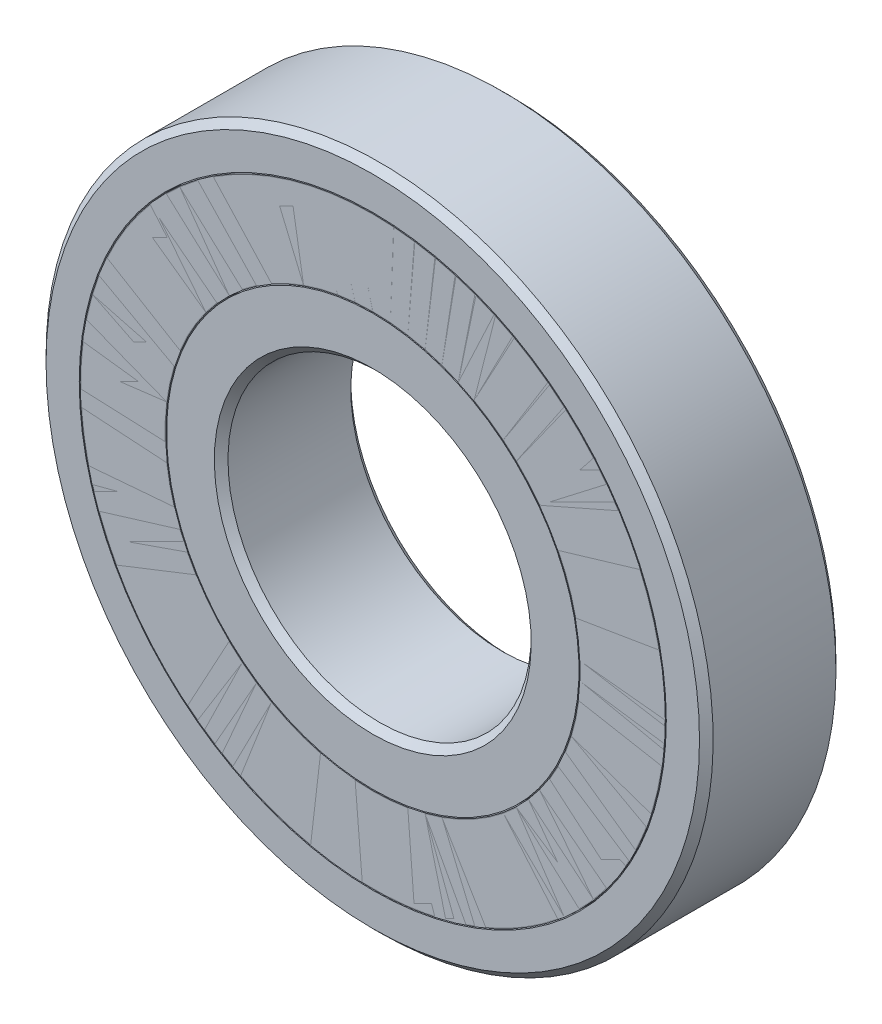
ISO-10303-21;
HEADER;
FILE_DESCRIPTION(('STEP AP214'),'2;1');
FILE_NAME('part.step','',(''),(''),'','','');
FILE_SCHEMA(('AUTOMOTIVE_DESIGN { 1 0 10303 214 1 1 1 1 }'));
ENDSEC;
DATA;
#1=APPLICATION_CONTEXT('core data for automotive mechanical design processes');
#2=APPLICATION_PROTOCOL_DEFINITION('international standard','automotive_design',2000,#1);
#3=PRODUCT_CONTEXT('',#1,'mechanical');
#4=PRODUCT('Part','Part','',(#3));
#5=PRODUCT_RELATED_PRODUCT_CATEGORY('part','',(#4));
#6=PRODUCT_DEFINITION_FORMATION('','',#4);
#7=PRODUCT_DEFINITION_CONTEXT('part definition',#1,'design');
#8=PRODUCT_DEFINITION('design','',#6,#7);
#9=PRODUCT_DEFINITION_SHAPE('','',#8);
#10=(LENGTH_UNIT() NAMED_UNIT(*) SI_UNIT(.MILLI.,.METRE.));
#11=(NAMED_UNIT(*) PLANE_ANGLE_UNIT() SI_UNIT($,.RADIAN.));
#12=(NAMED_UNIT(*) SI_UNIT($,.STERADIAN.) SOLID_ANGLE_UNIT());
#13=UNCERTAINTY_MEASURE_WITH_UNIT(LENGTH_MEASURE(1.E-05),#10,'distance_accuracy_value','');
#14=(GEOMETRIC_REPRESENTATION_CONTEXT(3) GLOBAL_UNCERTAINTY_ASSIGNED_CONTEXT((#13)) GLOBAL_UNIT_ASSIGNED_CONTEXT((#10,
#11,#12)) REPRESENTATION_CONTEXT('',''));
#15=CARTESIAN_POINT('',(0.,0.,0.));
#16=DIRECTION('',(0.,0.,1.));
#17=DIRECTION('',(1.,0.,0.));
#18=AXIS2_PLACEMENT_3D('',#15,#16,#17);
#19=CARTESIAN_POINT('',(0.,0.,-46.8926305280376));
#20=DIRECTION('',(0.,0.,1.));
#21=DIRECTION('',(0.,1.,0.));
#22=AXIS2_PLACEMENT_3D('',#19,#20,#21);
#23=CYLINDRICAL_SURFACE('',#22,15.3162);
#24=CARTESIAN_POINT('',(0.,0.,-3.540125));
#25=DIRECTION('',(0.,0.,-1.));
#26=DIRECTION('',(0.,1.,0.));
#27=AXIS2_PLACEMENT_3D('',#24,#25,#26);
#28=CIRCLE('',#27,15.3162);
#29=CARTESIAN_POINT('',(0.,15.3162,-3.540125));
#30=VERTEX_POINT('',#29);
#31=EDGE_CURVE('E11',#30,#30,#28,.T.);
#32=ORIENTED_EDGE('',*,*,#31,.F.);
#33=EDGE_LOOP('',(#32));
#34=FACE_BOUND('',#33,.T.);
#35=CARTESIAN_POINT('',(0.,0.,3.571875));
#36=DIRECTION('',(0.,0.,-1.));
#37=DIRECTION('',(0.,1.,0.));
#38=AXIS2_PLACEMENT_3D('',#35,#36,#37);
#39=CIRCLE('',#38,15.3162);
#40=CARTESIAN_POINT('',(0.,15.3162,3.571875));
#41=VERTEX_POINT('',#40);
#42=EDGE_CURVE('E63',#41,#41,#39,.T.);
#43=ORIENTED_EDGE('',*,*,#42,.T.);
#44=EDGE_LOOP('',(#43));
#45=FACE_BOUND('',#44,.T.);
#46=ADVANCED_FACE('F43',(#34,#45),#23,.T.);
#47=CARTESIAN_POINT('',(0.,0.,3.571875));
#48=DIRECTION('',(0.,0.,1.));
#49=DIRECTION('',(0.,1.,0.));
#50=AXIS2_PLACEMENT_3D('',#47,#48,#49);
#51=PLANE('',#50);
#52=CARTESIAN_POINT('',(0.,0.,3.571875));
#53=DIRECTION('',(0.,0.,-1.));
#54=DIRECTION('',(0.,1.,0.));
#55=AXIS2_PLACEMENT_3D('',#52,#53,#54);
#56=CIRCLE('',#55,10.8458);
#57=CARTESIAN_POINT('',(0.,10.8458,3.571875));
#58=VERTEX_POINT('',#57);
#59=EDGE_CURVE('E66',#58,#58,#56,.T.);
#60=ORIENTED_EDGE('',*,*,#59,.T.);
#61=EDGE_LOOP('',(#60));
#62=FACE_BOUND('',#61,.T.);
#63=ORIENTED_EDGE('',*,*,#42,.F.);
#64=EDGE_LOOP('',(#63));
#65=FACE_BOUND('',#64,.T.);
#66=ADVANCED_FACE('F70',(#62,#65),#51,.T.);
#67=CARTESIAN_POINT('',(0.,0.,-46.8926305280376));
#68=DIRECTION('',(0.,0.,1.));
#69=DIRECTION('',(0.,1.,0.));
#70=AXIS2_PLACEMENT_3D('',#67,#68,#69);
#71=CYLINDRICAL_SURFACE('',#70,10.8458);
#72=CARTESIAN_POINT('',(0.,0.,-3.540125));
#73=DIRECTION('',(0.,0.,-1.));
#74=DIRECTION('',(0.,1.,0.));
#75=AXIS2_PLACEMENT_3D('',#72,#73,#74);
#76=CIRCLE('',#75,10.8458);
#77=CARTESIAN_POINT('',(0.,10.8458,-3.540125));
#78=VERTEX_POINT('',#77);
#79=EDGE_CURVE('E58',#78,#78,#76,.F.);
#80=ORIENTED_EDGE('',*,*,#79,.F.);
#81=EDGE_LOOP('',(#80));
#82=FACE_BOUND('',#81,.T.);
#83=ORIENTED_EDGE('',*,*,#59,.F.);
#84=EDGE_LOOP('',(#83));
#85=FACE_BOUND('',#84,.T.);
#86=ADVANCED_FACE('F73',(#82,#85),#71,.F.);
#87=CARTESIAN_POINT('',(0.,17.1053125,-3.571875));
#88=DIRECTION('',(0.,0.,1.));
#89=DIRECTION('',(0.,1.,0.));
#90=AXIS2_PLACEMENT_3D('',#87,#88,#89);
#91=PLANE('',#90);
#92=CARTESIAN_POINT('',(0.,0.,-3.57187499999999));
#93=DIRECTION('',(0.,0.,-1.));
#94=DIRECTION('',(0.,1.,0.));
#95=AXIS2_PLACEMENT_3D('',#92,#93,#94);
#96=CIRCLE('',#95,10.87755);
#97=CARTESIAN_POINT('',(0.,10.87755,-3.571875));
#98=VERTEX_POINT('',#97);
#99=EDGE_CURVE('E50',#98,#98,#96,.T.);
#100=ORIENTED_EDGE('',*,*,#99,.F.);
#101=EDGE_LOOP('',(#100));
#102=FACE_BOUND('',#101,.T.);
#103=CARTESIAN_POINT('',(0.,0.,-3.57187499999999));
#104=DIRECTION('',(0.,0.,-1.));
#105=DIRECTION('',(0.,1.,0.));
#106=AXIS2_PLACEMENT_3D('',#103,#104,#105);
#107=CIRCLE('',#106,15.28445);
#108=CARTESIAN_POINT('',(0.,15.28445,-3.571875));
#109=VERTEX_POINT('',#108);
#110=EDGE_CURVE('E54',#109,#109,#107,.F.);
#111=ORIENTED_EDGE('',*,*,#110,.F.);
#112=EDGE_LOOP('',(#111));
#113=FACE_BOUND('',#112,.T.);
#114=ADVANCED_FACE('F75',(#102,#113),#91,.F.);
#115=CARTESIAN_POINT('',(0.,0.,-3.540125));
#116=DIRECTION('',(0.,0.,1.));
#117=DIRECTION('',(0.,1.,0.));
#118=AXIS2_PLACEMENT_3D('',#115,#116,#117);
#119=TOROIDAL_SURFACE('',#118,10.87755,0.03175);
#120=ORIENTED_EDGE('',*,*,#99,.T.);
#121=EDGE_LOOP('',(#120));
#122=FACE_BOUND('',#121,.T.);
#123=ORIENTED_EDGE('',*,*,#79,.T.);
#124=EDGE_LOOP('',(#123));
#125=FACE_BOUND('',#124,.T.);
#126=ADVANCED_FACE('F82',(#122,#125),#119,.T.);
#127=CARTESIAN_POINT('',(0.,0.,-3.540125));
#128=DIRECTION('',(0.,0.,1.));
#129=DIRECTION('',(0.,1.,0.));
#130=AXIS2_PLACEMENT_3D('',#127,#128,#129);
#131=TOROIDAL_SURFACE('',#130,15.28445,0.03175);
#132=ORIENTED_EDGE('',*,*,#31,.T.);
#133=EDGE_LOOP('',(#132));
#134=FACE_BOUND('',#133,.T.);
#135=ORIENTED_EDGE('',*,*,#110,.T.);
#136=EDGE_LOOP('',(#135));
#137=FACE_BOUND('',#136,.T.);
#138=ADVANCED_FACE('F45',(#134,#137),#131,.T.);
#139=CLOSED_SHELL('',(#46,#66,#86,#114,#126,#138));
#140=MANIFOLD_SOLID_BREP('B2',#139);
#141=CARTESIAN_POINT('',(0.,0.,46.8926305280376));
#142=DIRECTION('',(0.,0.,-1.));
#143=DIRECTION('',(0.,1.,0.));
#144=AXIS2_PLACEMENT_3D('',#141,#142,#143);
#145=CYLINDRICAL_SURFACE('',#144,15.3162);
#146=CARTESIAN_POINT('',(0.,0.,3.540125));
#147=DIRECTION('',(0.,0.,-1.));
#148=DIRECTION('',(0.,1.,0.));
#149=AXIS2_PLACEMENT_3D('',#146,#147,#148);
#150=CIRCLE('',#149,15.3162);
#151=CARTESIAN_POINT('',(0.,15.3162,3.540125));
#152=VERTEX_POINT('',#151);
#153=EDGE_CURVE('E42',#152,#152,#150,.T.);
#154=ORIENTED_EDGE('',*,*,#153,.T.);
#155=EDGE_LOOP('',(#154));
#156=FACE_BOUND('',#155,.T.);
#157=CARTESIAN_POINT('',(0.,0.,-3.571875));
#158=DIRECTION('',(0.,0.,-1.));
#159=DIRECTION('',(0.,1.,0.));
#160=AXIS2_PLACEMENT_3D('',#157,#158,#159);
#161=CIRCLE('',#160,15.3162);
#162=CARTESIAN_POINT('',(0.,15.3162,-3.571875));
#163=VERTEX_POINT('',#162);
#164=EDGE_CURVE('E187',#163,#163,#161,.T.);
#165=ORIENTED_EDGE('',*,*,#164,.F.);
#166=EDGE_LOOP('',(#165));
#167=FACE_BOUND('',#166,.T.);
#168=ADVANCED_FACE('F167',(#156,#167),#145,.T.);
#169=CARTESIAN_POINT('',(0.,0.,-3.571875));
#170=DIRECTION('',(0.,0.,-1.));
#171=DIRECTION('',(0.,1.,0.));
#172=AXIS2_PLACEMENT_3D('',#169,#170,#171);
#173=PLANE('',#172);
#174=CARTESIAN_POINT('',(0.,0.,-3.571875));
#175=DIRECTION('',(0.,0.,-1.));
#176=DIRECTION('',(0.,1.,0.));
#177=AXIS2_PLACEMENT_3D('',#174,#175,#176);
#178=CIRCLE('',#177,10.8458);
#179=CARTESIAN_POINT('',(0.,10.8458,-3.571875));
#180=VERTEX_POINT('',#179);
#181=EDGE_CURVE('E190',#180,#180,#178,.T.);
#182=ORIENTED_EDGE('',*,*,#181,.F.);
#183=EDGE_LOOP('',(#182));
#184=FACE_BOUND('',#183,.T.);
#185=ORIENTED_EDGE('',*,*,#164,.T.);
#186=EDGE_LOOP('',(#185));
#187=FACE_BOUND('',#186,.T.);
#188=ADVANCED_FACE('F196',(#184,#187),#173,.T.);
#189=CARTESIAN_POINT('',(0.,0.,46.8926305280376));
#190=DIRECTION('',(0.,0.,-1.));
#191=DIRECTION('',(0.,1.,0.));
#192=AXIS2_PLACEMENT_3D('',#189,#190,#191);
#193=CYLINDRICAL_SURFACE('',#192,10.8458);
#194=CARTESIAN_POINT('',(0.,0.,3.540125));
#195=DIRECTION('',(0.,0.,-1.));
#196=DIRECTION('',(0.,1.,0.));
#197=AXIS2_PLACEMENT_3D('',#194,#195,#196);
#198=CIRCLE('',#197,10.8458);
#199=CARTESIAN_POINT('',(0.,10.8458,3.540125));
#200=VERTEX_POINT('',#199);
#201=EDGE_CURVE('E182',#200,#200,#198,.F.);
#202=ORIENTED_EDGE('',*,*,#201,.T.);
#203=EDGE_LOOP('',(#202));
#204=FACE_BOUND('',#203,.T.);
#205=ORIENTED_EDGE('',*,*,#181,.T.);
#206=EDGE_LOOP('',(#205));
#207=FACE_BOUND('',#206,.T.);
#208=ADVANCED_FACE('F194',(#204,#207),#193,.F.);
#209=CARTESIAN_POINT('',(0.,17.1053125,3.571875));
#210=DIRECTION('',(0.,0.,-1.));
#211=DIRECTION('',(0.,1.,0.));
#212=AXIS2_PLACEMENT_3D('',#209,#210,#211);
#213=PLANE('',#212);
#214=CARTESIAN_POINT('',(0.,0.,3.57187499999999));
#215=DIRECTION('',(0.,0.,-1.));
#216=DIRECTION('',(0.,1.,0.));
#217=AXIS2_PLACEMENT_3D('',#214,#215,#216);
#218=CIRCLE('',#217,10.87755);
#219=CARTESIAN_POINT('',(0.,10.87755,3.571875));
#220=VERTEX_POINT('',#219);
#221=EDGE_CURVE('E174',#220,#220,#218,.T.);
#222=ORIENTED_EDGE('',*,*,#221,.T.);
#223=EDGE_LOOP('',(#222));
#224=FACE_BOUND('',#223,.T.);
#225=CARTESIAN_POINT('',(0.,0.,3.57187499999999));
#226=DIRECTION('',(0.,0.,-1.));
#227=DIRECTION('',(0.,1.,0.));
#228=AXIS2_PLACEMENT_3D('',#225,#226,#227);
#229=CIRCLE('',#228,15.28445);
#230=CARTESIAN_POINT('',(0.,15.28445,3.571875));
#231=VERTEX_POINT('',#230);
#232=EDGE_CURVE('E178',#231,#231,#229,.F.);
#233=ORIENTED_EDGE('',*,*,#232,.T.);
#234=EDGE_LOOP('',(#233));
#235=FACE_BOUND('',#234,.T.);
#236=ADVANCED_FACE('F209',(#224,#235),#213,.F.);
#237=CARTESIAN_POINT('',(0.,0.,3.540125));
#238=DIRECTION('',(0.,0.,-1.));
#239=DIRECTION('',(0.,1.,0.));
#240=AXIS2_PLACEMENT_3D('',#237,#238,#239);
#241=TOROIDAL_SURFACE('',#240,10.87755,0.03175);
#242=ORIENTED_EDGE('',*,*,#221,.F.);
#243=EDGE_LOOP('',(#242));
#244=FACE_BOUND('',#243,.T.);
#245=ORIENTED_EDGE('',*,*,#201,.F.);
#246=EDGE_LOOP('',(#245));
#247=FACE_BOUND('',#246,.T.);
#248=ADVANCED_FACE('F207',(#244,#247),#241,.T.);
#249=CARTESIAN_POINT('',(0.,0.,3.540125));
#250=DIRECTION('',(0.,0.,-1.));
#251=DIRECTION('',(0.,1.,0.));
#252=AXIS2_PLACEMENT_3D('',#249,#250,#251);
#253=TOROIDAL_SURFACE('',#252,15.28445,0.03175);
#254=ORIENTED_EDGE('',*,*,#153,.F.);
#255=EDGE_LOOP('',(#254));
#256=FACE_BOUND('',#255,.T.);
#257=ORIENTED_EDGE('',*,*,#232,.F.);
#258=EDGE_LOOP('',(#257));
#259=FACE_BOUND('',#258,.T.);
#260=ADVANCED_FACE('F169',(#256,#259),#253,.T.);
#261=CLOSED_SHELL('',(#168,#188,#208,#236,#248,#260));
#262=MANIFOLD_SOLID_BREP('B6',#261);
#263=CARTESIAN_POINT('',(0.,0.,3.571875));
#264=DIRECTION('',(0.,0.,1.));
#265=DIRECTION('',(0.,-1.,0.));
#266=AXIS2_PLACEMENT_3D('',#263,#264,#265);
#267=CYLINDRICAL_SURFACE('',#266,10.795);
#268=CARTESIAN_POINT('',(0.,0.,3.571875));
#269=DIRECTION('',(0.,0.,1.));
#270=DIRECTION('',(0.,-1.,0.));
#271=AXIS2_PLACEMENT_3D('',#268,#269,#270);
#272=CIRCLE('',#271,10.795);
#273=CARTESIAN_POINT('',(0.,-10.795,3.57187499999999));
#274=VERTEX_POINT('',#273);
#275=EDGE_CURVE('E166',#274,#274,#272,.T.);
#276=ORIENTED_EDGE('',*,*,#275,.F.);
#277=EDGE_LOOP('',(#276));
#278=FACE_BOUND('',#277,.T.);
#279=CARTESIAN_POINT('',(0.,0.,1.5875));
#280=DIRECTION('',(0.,0.,1.));
#281=DIRECTION('',(0.,-1.,0.));
#282=AXIS2_PLACEMENT_3D('',#279,#280,#281);
#283=CIRCLE('',#282,10.795);
#284=CARTESIAN_POINT('',(0.,-10.795,1.5875));
#285=VERTEX_POINT('',#284);
#286=EDGE_CURVE('E293',#285,#285,#283,.T.);
#287=ORIENTED_EDGE('',*,*,#286,.T.);
#288=EDGE_LOOP('',(#287));
#289=FACE_BOUND('',#288,.T.);
#290=ADVANCED_FACE('F265',(#278,#289),#267,.T.);
#291=CARTESIAN_POINT('',(0.,8.29468749999999,3.571875));
#292=DIRECTION('',(0.,0.,-1.));
#293=DIRECTION('',(0.,1.,0.));
#294=AXIS2_PLACEMENT_3D('',#291,#292,#293);
#295=PLANE('',#294);
#296=CARTESIAN_POINT('',(0.,0.,3.571875));
#297=DIRECTION('',(0.,0.,1.));
#298=DIRECTION('',(0.,-1.,0.));
#299=AXIS2_PLACEMENT_3D('',#296,#297,#298);
#300=CIRCLE('',#299,8.29468749999999);
#301=CARTESIAN_POINT('',(0.,-8.29468749999999,3.57187499999999));
#302=VERTEX_POINT('',#301);
#303=EDGE_CURVE('E271',#302,#302,#300,.T.);
#304=ORIENTED_EDGE('',*,*,#303,.F.);
#305=EDGE_LOOP('',(#304));
#306=FACE_BOUND('',#305,.T.);
#307=ORIENTED_EDGE('',*,*,#275,.T.);
#308=EDGE_LOOP('',(#307));
#309=FACE_BOUND('',#308,.T.);
#310=ADVANCED_FACE('F330',(#306,#309),#295,.F.);
#311=CARTESIAN_POINT('',(0.,0.,3.571875));
#312=DIRECTION('',(0.,0.,1.));
#313=DIRECTION('',(0.,-1.,0.));
#314=AXIS2_PLACEMENT_3D('',#311,#312,#313);
#315=CONICAL_SURFACE('',#314,8.29468749999999,0.785398163397436);
#316=CARTESIAN_POINT('',(0.,0.,3.2146875));
#317=DIRECTION('',(0.,0.,1.));
#318=DIRECTION('',(0.,-1.,0.));
#319=AXIS2_PLACEMENT_3D('',#316,#317,#318);
#320=CIRCLE('',#319,7.9375);
#321=CARTESIAN_POINT('',(0.,-7.9375,3.21468749999999));
#322=VERTEX_POINT('',#321);
#323=EDGE_CURVE('E275',#322,#322,#320,.T.);
#324=ORIENTED_EDGE('',*,*,#323,.F.);
#325=EDGE_LOOP('',(#324));
#326=FACE_BOUND('',#325,.T.);
#327=ORIENTED_EDGE('',*,*,#303,.T.);
#328=EDGE_LOOP('',(#327));
#329=FACE_BOUND('',#328,.T.);
#330=ADVANCED_FACE('F325',(#326,#329),#315,.F.);
#331=CARTESIAN_POINT('',(0.,0.,3.571875));
#332=DIRECTION('',(0.,0.,1.));
#333=DIRECTION('',(0.,-1.,0.));
#334=AXIS2_PLACEMENT_3D('',#331,#332,#333);
#335=CYLINDRICAL_SURFACE('',#334,7.9375);
#336=CARTESIAN_POINT('',(0.,0.,-3.2146875));
#337=DIRECTION('',(0.,0.,1.));
#338=DIRECTION('',(0.,-1.,0.));
#339=AXIS2_PLACEMENT_3D('',#336,#337,#338);
#340=CIRCLE('',#339,7.9375);
#341=CARTESIAN_POINT('',(0.,-7.9375,-3.2146875));
#342=VERTEX_POINT('',#341);
#343=EDGE_CURVE('E279',#342,#342,#340,.T.);
#344=ORIENTED_EDGE('',*,*,#343,.F.);
#345=EDGE_LOOP('',(#344));
#346=FACE_BOUND('',#345,.T.);
#347=ORIENTED_EDGE('',*,*,#323,.T.);
#348=EDGE_LOOP('',(#347));
#349=FACE_BOUND('',#348,.T.);
#350=ADVANCED_FACE('F319',(#346,#349),#335,.F.);
#351=CARTESIAN_POINT('',(0.,0.,-3.2146875));
#352=DIRECTION('',(0.,0.,-1.));
#353=DIRECTION('',(0.,1.,0.));
#354=AXIS2_PLACEMENT_3D('',#351,#352,#353);
#355=CONICAL_SURFACE('',#354,7.9375,0.785398163397419);
#356=CARTESIAN_POINT('',(0.,0.,-3.57187500000001));
#357=DIRECTION('',(0.,0.,1.));
#358=DIRECTION('',(0.,-1.,0.));
#359=AXIS2_PLACEMENT_3D('',#356,#357,#358);
#360=CIRCLE('',#359,8.29468749999999);
#361=CARTESIAN_POINT('',(0.,-8.29468749999999,-3.57187500000001));
#362=VERTEX_POINT('',#361);
#363=EDGE_CURVE('E284',#362,#362,#360,.T.);
#364=ORIENTED_EDGE('',*,*,#363,.F.);
#365=EDGE_LOOP('',(#364));
#366=FACE_BOUND('',#365,.T.);
#367=ORIENTED_EDGE('',*,*,#343,.T.);
#368=EDGE_LOOP('',(#367));
#369=FACE_BOUND('',#368,.T.);
#370=ADVANCED_FACE('F313',(#366,#369),#355,.F.);
#371=CARTESIAN_POINT('',(0.,8.29468749999999,-3.571875));
#372=DIRECTION('',(0.,0.,1.));
#373=DIRECTION('',(0.,-1.,0.));
#374=AXIS2_PLACEMENT_3D('',#371,#372,#373);
#375=PLANE('',#374);
#376=CARTESIAN_POINT('',(0.,0.,-3.571875));
#377=DIRECTION('',(0.,0.,1.));
#378=DIRECTION('',(0.,-1.,0.));
#379=AXIS2_PLACEMENT_3D('',#376,#377,#378);
#380=CIRCLE('',#379,10.795);
#381=CARTESIAN_POINT('',(0.,-10.795,-3.571875));
#382=VERTEX_POINT('',#381);
#383=EDGE_CURVE('E287',#382,#382,#380,.T.);
#384=ORIENTED_EDGE('',*,*,#383,.F.);
#385=EDGE_LOOP('',(#384));
#386=FACE_BOUND('',#385,.T.);
#387=ORIENTED_EDGE('',*,*,#363,.T.);
#388=EDGE_LOOP('',(#387));
#389=FACE_BOUND('',#388,.T.);
#390=ADVANCED_FACE('F307',(#386,#389),#375,.F.);
#391=CARTESIAN_POINT('',(0.,0.,3.571875));
#392=DIRECTION('',(0.,0.,1.));
#393=DIRECTION('',(0.,-1.,0.));
#394=AXIS2_PLACEMENT_3D('',#391,#392,#393);
#395=CYLINDRICAL_SURFACE('',#394,10.795);
#396=CARTESIAN_POINT('',(0.,0.,-1.5875));
#397=DIRECTION('',(0.,0.,1.));
#398=DIRECTION('',(0.,-1.,0.));
#399=AXIS2_PLACEMENT_3D('',#396,#397,#398);
#400=CIRCLE('',#399,10.795);
#401=CARTESIAN_POINT('',(0.,-10.795,-1.58750000000001));
#402=VERTEX_POINT('',#401);
#403=EDGE_CURVE('E290',#402,#402,#400,.T.);
#404=ORIENTED_EDGE('',*,*,#403,.F.);
#405=EDGE_LOOP('',(#404));
#406=FACE_BOUND('',#405,.T.);
#407=ORIENTED_EDGE('',*,*,#383,.T.);
#408=EDGE_LOOP('',(#407));
#409=FACE_BOUND('',#408,.T.);
#410=ADVANCED_FACE('F301',(#406,#409),#395,.T.);
#411=CARTESIAN_POINT('',(0.,0.,0.));
#412=DIRECTION('',(0.,0.,1.));
#413=DIRECTION('',(0.,-1.,0.));
#414=AXIS2_PLACEMENT_3D('',#411,#412,#413);
#415=TOROIDAL_SURFACE('',#414,13.462,3.10371475010188);
#416=ORIENTED_EDGE('',*,*,#286,.F.);
#417=EDGE_LOOP('',(#416));
#418=FACE_BOUND('',#417,.T.);
#419=ORIENTED_EDGE('',*,*,#403,.T.);
#420=EDGE_LOOP('',(#419));
#421=FACE_BOUND('',#420,.T.);
#422=ADVANCED_FACE('F298',(#418,#421),#415,.F.);
#423=CLOSED_SHELL('',(#290,#310,#330,#350,#370,#390,#410,#422));
#424=MANIFOLD_SOLID_BREP('B37',#423);
#425=CARTESIAN_POINT('',(0.,0.,3.571875));
#426=DIRECTION('',(0.,0.,1.));
#427=DIRECTION('',(0.,-1.,0.));
#428=AXIS2_PLACEMENT_3D('',#425,#426,#427);
#429=CYLINDRICAL_SURFACE('',#428,17.4625);
#430=CARTESIAN_POINT('',(0.,0.,3.21468749999999));
#431=DIRECTION('',(0.,0.,1.));
#432=DIRECTION('',(0.,-1.,0.));
#433=AXIS2_PLACEMENT_3D('',#430,#431,#432);
#434=CIRCLE('',#433,17.4625);
#435=CARTESIAN_POINT('',(0.,-17.4625,3.21468749999999));
#436=VERTEX_POINT('',#435);
#437=EDGE_CURVE('E264',#436,#436,#434,.T.);
#438=ORIENTED_EDGE('',*,*,#437,.F.);
#439=EDGE_LOOP('',(#438));
#440=FACE_BOUND('',#439,.T.);
#441=CARTESIAN_POINT('',(0.,0.,-3.2146875));
#442=DIRECTION('',(0.,0.,1.));
#443=DIRECTION('',(0.,-1.,0.));
#444=AXIS2_PLACEMENT_3D('',#441,#442,#443);
#445=CIRCLE('',#444,17.4625);
#446=CARTESIAN_POINT('',(0.,-17.4625,-3.21468750000001));
#447=VERTEX_POINT('',#446);
#448=EDGE_CURVE('E414',#447,#447,#445,.T.);
#449=ORIENTED_EDGE('',*,*,#448,.T.);
#450=EDGE_LOOP('',(#449));
#451=FACE_BOUND('',#450,.T.);
#452=ADVANCED_FACE('F386',(#440,#451),#429,.T.);
#453=CARTESIAN_POINT('',(0.,0.,3.21468749999999));
#454=DIRECTION('',(0.,0.,-1.));
#455=DIRECTION('',(0.,1.,0.));
#456=AXIS2_PLACEMENT_3D('',#453,#454,#455);
#457=CONICAL_SURFACE('',#456,17.4625,0.785398163397446);
#458=CARTESIAN_POINT('',(0.,0.,3.57187499999999));
#459=DIRECTION('',(0.,0.,1.));
#460=DIRECTION('',(0.,-1.,0.));
#461=AXIS2_PLACEMENT_3D('',#458,#459,#460);
#462=CIRCLE('',#461,17.1053125);
#463=CARTESIAN_POINT('',(0.,-17.1053125,3.57187499999999));
#464=VERTEX_POINT('',#463);
#465=EDGE_CURVE('E392',#464,#464,#462,.T.);
#466=ORIENTED_EDGE('',*,*,#465,.F.);
#467=EDGE_LOOP('',(#466));
#468=FACE_BOUND('',#467,.T.);
#469=ORIENTED_EDGE('',*,*,#437,.T.);
#470=EDGE_LOOP('',(#469));
#471=FACE_BOUND('',#470,.T.);
#472=ADVANCED_FACE('F451',(#468,#471),#457,.T.);
#473=CARTESIAN_POINT('',(0.,17.1053125,3.571875));
#474=DIRECTION('',(0.,0.,-1.));
#475=DIRECTION('',(0.,1.,0.));
#476=AXIS2_PLACEMENT_3D('',#473,#474,#475);
#477=PLANE('',#476);
#478=CARTESIAN_POINT('',(0.,0.,3.57187499999999));
#479=DIRECTION('',(0.,0.,1.));
#480=DIRECTION('',(0.,-1.,0.));
#481=AXIS2_PLACEMENT_3D('',#478,#479,#480);
#482=CIRCLE('',#481,15.367);
#483=CARTESIAN_POINT('',(0.,-15.367,3.57187499999999));
#484=VERTEX_POINT('',#483);
#485=EDGE_CURVE('E396',#484,#484,#482,.T.);
#486=ORIENTED_EDGE('',*,*,#485,.F.);
#487=EDGE_LOOP('',(#486));
#488=FACE_BOUND('',#487,.T.);
#489=ORIENTED_EDGE('',*,*,#465,.T.);
#490=EDGE_LOOP('',(#489));
#491=FACE_BOUND('',#490,.T.);
#492=ADVANCED_FACE('F446',(#488,#491),#477,.F.);
#493=CARTESIAN_POINT('',(0.,0.,3.571875));
#494=DIRECTION('',(0.,0.,1.));
#495=DIRECTION('',(0.,-1.,0.));
#496=AXIS2_PLACEMENT_3D('',#493,#494,#495);
#497=CYLINDRICAL_SURFACE('',#496,15.367);
#498=CARTESIAN_POINT('',(0.,0.,1.5875));
#499=DIRECTION('',(0.,0.,1.));
#500=DIRECTION('',(0.,-1.,0.));
#501=AXIS2_PLACEMENT_3D('',#498,#499,#500);
#502=CIRCLE('',#501,15.367);
#503=CARTESIAN_POINT('',(0.,-15.367,1.58749999999999));
#504=VERTEX_POINT('',#503);
#505=EDGE_CURVE('E400',#504,#504,#502,.T.);
#506=ORIENTED_EDGE('',*,*,#505,.F.);
#507=EDGE_LOOP('',(#506));
#508=FACE_BOUND('',#507,.T.);
#509=ORIENTED_EDGE('',*,*,#485,.T.);
#510=EDGE_LOOP('',(#509));
#511=FACE_BOUND('',#510,.T.);
#512=ADVANCED_FACE('F440',(#508,#511),#497,.F.);
#513=CARTESIAN_POINT('',(0.,0.,0.));
#514=DIRECTION('',(0.,0.,1.));
#515=DIRECTION('',(0.,-1.,0.));
#516=AXIS2_PLACEMENT_3D('',#513,#514,#515);
#517=TOROIDAL_SURFACE('',#516,12.7,3.10371475010188);
#518=CARTESIAN_POINT('',(0.,0.,-1.5875));
#519=DIRECTION('',(0.,0.,1.));
#520=DIRECTION('',(0.,-1.,0.));
#521=AXIS2_PLACEMENT_3D('',#518,#519,#520);
#522=CIRCLE('',#521,15.367);
#523=CARTESIAN_POINT('',(0.,-15.367,-1.58750000000001));
#524=VERTEX_POINT('',#523);
#525=EDGE_CURVE('E405',#524,#524,#522,.T.);
#526=ORIENTED_EDGE('',*,*,#525,.F.);
#527=EDGE_LOOP('',(#526));
#528=FACE_BOUND('',#527,.T.);
#529=ORIENTED_EDGE('',*,*,#505,.T.);
#530=EDGE_LOOP('',(#529));
#531=FACE_BOUND('',#530,.T.);
#532=ADVANCED_FACE('F434',(#528,#531),#517,.F.);
#533=CARTESIAN_POINT('',(0.,0.,3.571875));
#534=DIRECTION('',(0.,0.,1.));
#535=DIRECTION('',(0.,-1.,0.));
#536=AXIS2_PLACEMENT_3D('',#533,#534,#535);
#537=CYLINDRICAL_SURFACE('',#536,15.367);
#538=CARTESIAN_POINT('',(0.,0.,-3.571875));
#539=DIRECTION('',(0.,0.,1.));
#540=DIRECTION('',(0.,-1.,0.));
#541=AXIS2_PLACEMENT_3D('',#538,#539,#540);
#542=CIRCLE('',#541,15.367);
#543=CARTESIAN_POINT('',(0.,-15.367,-3.57187500000001));
#544=VERTEX_POINT('',#543);
#545=EDGE_CURVE('E408',#544,#544,#542,.T.);
#546=ORIENTED_EDGE('',*,*,#545,.F.);
#547=EDGE_LOOP('',(#546));
#548=FACE_BOUND('',#547,.T.);
#549=ORIENTED_EDGE('',*,*,#525,.T.);
#550=EDGE_LOOP('',(#549));
#551=FACE_BOUND('',#550,.T.);
#552=ADVANCED_FACE('F428',(#548,#551),#537,.F.);
#553=CARTESIAN_POINT('',(0.,17.1053125,-3.571875));
#554=DIRECTION('',(0.,0.,1.));
#555=DIRECTION('',(0.,-1.,0.));
#556=AXIS2_PLACEMENT_3D('',#553,#554,#555);
#557=PLANE('',#556);
#558=CARTESIAN_POINT('',(0.,0.,-3.57187500000001));
#559=DIRECTION('',(0.,0.,1.));
#560=DIRECTION('',(0.,-1.,0.));
#561=AXIS2_PLACEMENT_3D('',#558,#559,#560);
#562=CIRCLE('',#561,17.1053125);
#563=CARTESIAN_POINT('',(0.,-17.1053125,-3.57187500000001));
#564=VERTEX_POINT('',#563);
#565=EDGE_CURVE('E411',#564,#564,#562,.T.);
#566=ORIENTED_EDGE('',*,*,#565,.F.);
#567=EDGE_LOOP('',(#566));
#568=FACE_BOUND('',#567,.T.);
#569=ORIENTED_EDGE('',*,*,#545,.T.);
#570=EDGE_LOOP('',(#569));
#571=FACE_BOUND('',#570,.T.);
#572=ADVANCED_FACE('F422',(#568,#571),#557,.F.);
#573=CARTESIAN_POINT('',(0.,0.,-3.57187500000001));
#574=DIRECTION('',(0.,0.,1.));
#575=DIRECTION('',(0.,-1.,0.));
#576=AXIS2_PLACEMENT_3D('',#573,#574,#575);
#577=CONICAL_SURFACE('',#576,17.1053125,0.785398163397445);
#578=ORIENTED_EDGE('',*,*,#448,.F.);
#579=EDGE_LOOP('',(#578));
#580=FACE_BOUND('',#579,.T.);
#581=ORIENTED_EDGE('',*,*,#565,.T.);
#582=EDGE_LOOP('',(#581));
#583=FACE_BOUND('',#582,.T.);
#584=ADVANCED_FACE('F419',(#580,#583),#577,.T.);
#585=CLOSED_SHELL('',(#452,#472,#492,#512,#532,#552,#572,#584));
#586=MANIFOLD_SOLID_BREP('B161',#585);
#587=ADVANCED_BREP_SHAPE_REPRESENTATION('',(#18,#140,#262,#424,#586),#14);
#588=SHAPE_DEFINITION_REPRESENTATION(#9,#587);
ENDSEC;
END-ISO-10303-21;
